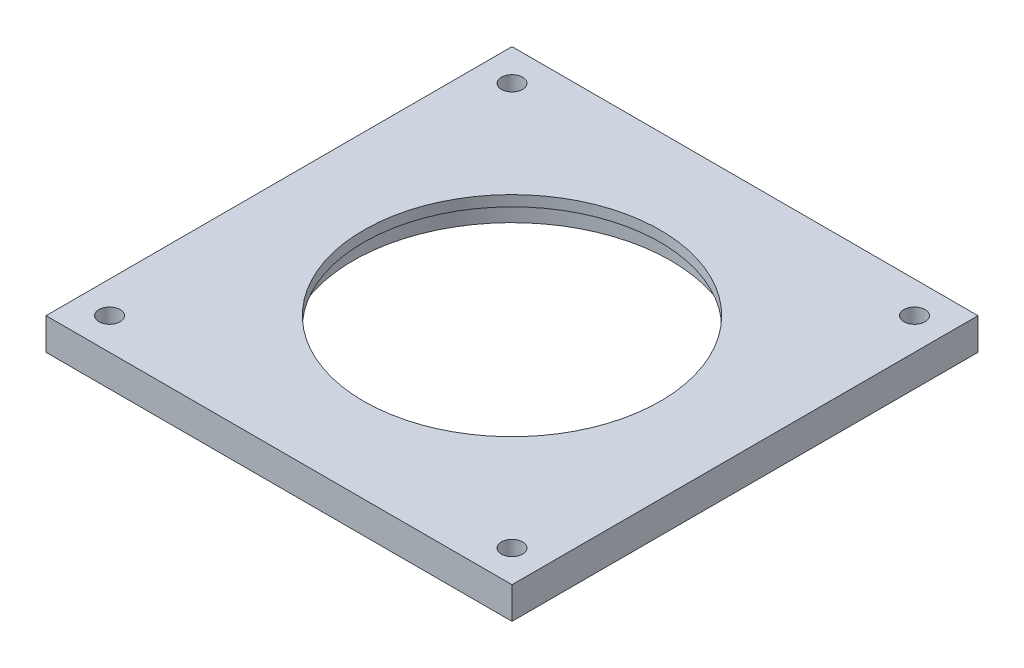
ISO-10303-21;
HEADER;
FILE_DESCRIPTION(('STEP AP214'),'2;1');
FILE_NAME('part.step','',(''),(''),'','','');
FILE_SCHEMA(('AUTOMOTIVE_DESIGN { 1 0 10303 214 1 1 1 1 }'));
ENDSEC;
DATA;
#1=APPLICATION_CONTEXT('core data for automotive mechanical design processes');
#2=APPLICATION_PROTOCOL_DEFINITION('international standard','automotive_design',2000,#1);
#3=PRODUCT_CONTEXT('',#1,'mechanical');
#4=PRODUCT('Part','Part','',(#3));
#5=PRODUCT_RELATED_PRODUCT_CATEGORY('part','',(#4));
#6=PRODUCT_DEFINITION_FORMATION('','',#4);
#7=PRODUCT_DEFINITION_CONTEXT('part definition',#1,'design');
#8=PRODUCT_DEFINITION('design','',#6,#7);
#9=PRODUCT_DEFINITION_SHAPE('','',#8);
#10=(LENGTH_UNIT() NAMED_UNIT(*) SI_UNIT(.MILLI.,.METRE.));
#11=(NAMED_UNIT(*) PLANE_ANGLE_UNIT() SI_UNIT($,.RADIAN.));
#12=(NAMED_UNIT(*) SI_UNIT($,.STERADIAN.) SOLID_ANGLE_UNIT());
#13=UNCERTAINTY_MEASURE_WITH_UNIT(LENGTH_MEASURE(1.E-05),#10,'distance_accuracy_value','');
#14=(GEOMETRIC_REPRESENTATION_CONTEXT(3) GLOBAL_UNCERTAINTY_ASSIGNED_CONTEXT((#13)) GLOBAL_UNIT_ASSIGNED_CONTEXT((#10,
#11,#12)) REPRESENTATION_CONTEXT('',''));
#15=CARTESIAN_POINT('',(0.,0.,0.));
#16=DIRECTION('',(0.,0.,1.));
#17=DIRECTION('',(1.,0.,0.));
#18=AXIS2_PLACEMENT_3D('',#15,#16,#17);
#19=CARTESIAN_POINT('',(22.,3.,-22.));
#20=DIRECTION('',(0.,1.,0.));
#21=DIRECTION('',(0.,0.,1.));
#22=AXIS2_PLACEMENT_3D('',#19,#20,#21);
#23=PLANE('',#22);
#24=DIRECTION('',(0.,0.,1.));
#25=VECTOR('',#24,1.);
#26=CARTESIAN_POINT('',(44.,3.,0.));
#27=LINE('',#26,#25);
#28=CARTESIAN_POINT('',(44.,3.,-44.));
#29=VERTEX_POINT('',#28);
#30=CARTESIAN_POINT('',(44.,3.,0.));
#31=VERTEX_POINT('',#30);
#32=EDGE_CURVE('E83',#29,#31,#27,.T.);
#33=ORIENTED_EDGE('',*,*,#32,.F.);
#34=DIRECTION('',(1.,0.,0.));
#35=VECTOR('',#34,1.);
#36=CARTESIAN_POINT('',(0.,3.,-44.));
#37=LINE('',#36,#35);
#38=CARTESIAN_POINT('',(0.,3.,-44.));
#39=VERTEX_POINT('',#38);
#40=EDGE_CURVE('E86',#39,#29,#37,.T.);
#41=ORIENTED_EDGE('',*,*,#40,.F.);
#42=DIRECTION('',(0.,0.,1.));
#43=VECTOR('',#42,1.);
#44=CARTESIAN_POINT('',(0.,3.,0.));
#45=LINE('',#44,#43);
#46=CARTESIAN_POINT('',(0.,3.,0.));
#47=VERTEX_POINT('',#46);
#48=EDGE_CURVE('E162',#39,#47,#45,.T.);
#49=ORIENTED_EDGE('',*,*,#48,.T.);
#50=DIRECTION('',(1.,0.,0.));
#51=VECTOR('',#50,1.);
#52=CARTESIAN_POINT('',(0.,3.,0.));
#53=LINE('',#52,#51);
#54=EDGE_CURVE('E60',#47,#31,#53,.T.);
#55=ORIENTED_EDGE('',*,*,#54,.T.);
#56=EDGE_LOOP('',(#33,#41,#49,#55));
#57=FACE_BOUND('',#56,.T.);
#58=CARTESIAN_POINT('',(22.,3.,-22.));
#59=DIRECTION('',(0.,-1.,0.));
#60=DIRECTION('',(0.,0.,1.));
#61=AXIS2_PLACEMENT_3D('',#58,#59,#60);
#62=CIRCLE('',#61,14.);
#63=CARTESIAN_POINT('',(22.,3.,-8.));
#64=VERTEX_POINT('',#63);
#65=EDGE_CURVE('E55',#64,#64,#62,.T.);
#66=ORIENTED_EDGE('',*,*,#65,.T.);
#67=EDGE_LOOP('',(#66));
#68=FACE_BOUND('',#67,.T.);
#69=CARTESIAN_POINT('',(3.,3.,-3.));
#70=DIRECTION('',(0.,1.,0.));
#71=DIRECTION('',(0.,0.,1.));
#72=AXIS2_PLACEMENT_3D('',#69,#70,#71);
#73=CIRCLE('',#72,1.);
#74=CARTESIAN_POINT('',(3.,3.,-2.));
#75=VERTEX_POINT('',#74);
#76=EDGE_CURVE('E154',#75,#75,#73,.T.);
#77=ORIENTED_EDGE('',*,*,#76,.F.);
#78=EDGE_LOOP('',(#77));
#79=FACE_BOUND('',#78,.T.);
#80=CARTESIAN_POINT('',(41.,3.,-3.));
#81=DIRECTION('',(0.,-1.,0.));
#82=DIRECTION('',(0.,0.,1.));
#83=AXIS2_PLACEMENT_3D('',#80,#81,#82);
#84=CIRCLE('',#83,1.);
#85=CARTESIAN_POINT('',(41.,3.,-2.));
#86=VERTEX_POINT('',#85);
#87=EDGE_CURVE('E130',#86,#86,#84,.T.);
#88=ORIENTED_EDGE('',*,*,#87,.T.);
#89=EDGE_LOOP('',(#88));
#90=FACE_BOUND('',#89,.T.);
#91=CARTESIAN_POINT('',(3.,3.,-41.));
#92=DIRECTION('',(0.,-1.,0.));
#93=DIRECTION('',(0.,0.,-1.));
#94=AXIS2_PLACEMENT_3D('',#91,#92,#93);
#95=CIRCLE('',#94,1.);
#96=CARTESIAN_POINT('',(3.,3.,-42.));
#97=VERTEX_POINT('',#96);
#98=EDGE_CURVE('E115',#97,#97,#95,.T.);
#99=ORIENTED_EDGE('',*,*,#98,.T.);
#100=EDGE_LOOP('',(#99));
#101=FACE_BOUND('',#100,.T.);
#102=CARTESIAN_POINT('',(41.,3.,-41.));
#103=DIRECTION('',(0.,1.,0.));
#104=DIRECTION('',(0.,0.,-1.));
#105=AXIS2_PLACEMENT_3D('',#102,#103,#104);
#106=CIRCLE('',#105,1.);
#107=CARTESIAN_POINT('',(41.,3.,-42.));
#108=VERTEX_POINT('',#107);
#109=EDGE_CURVE('E110',#108,#108,#106,.T.);
#110=ORIENTED_EDGE('',*,*,#109,.F.);
#111=EDGE_LOOP('',(#110));
#112=FACE_BOUND('',#111,.T.);
#113=ADVANCED_FACE('F45',(#57,#68,#79,#90,#101,#112),#23,.T.);
#114=CARTESIAN_POINT('',(22.,0.,-22.));
#115=DIRECTION('',(0.,1.,0.));
#116=DIRECTION('',(0.,0.,1.));
#117=AXIS2_PLACEMENT_3D('',#114,#115,#116);
#118=PLANE('',#117);
#119=DIRECTION('',(1.,0.,0.));
#120=VECTOR('',#119,1.);
#121=CARTESIAN_POINT('',(0.,0.,-44.));
#122=LINE('',#121,#120);
#123=CARTESIAN_POINT('',(0.,0.,-44.));
#124=VERTEX_POINT('',#123);
#125=CARTESIAN_POINT('',(44.,0.,-44.));
#126=VERTEX_POINT('',#125);
#127=EDGE_CURVE('E103',#124,#126,#122,.T.);
#128=ORIENTED_EDGE('',*,*,#127,.T.);
#129=DIRECTION('',(0.,0.,1.));
#130=VECTOR('',#129,1.);
#131=CARTESIAN_POINT('',(44.,0.,0.));
#132=LINE('',#131,#130);
#133=CARTESIAN_POINT('',(44.,0.,0.));
#134=VERTEX_POINT('',#133);
#135=EDGE_CURVE('E92',#126,#134,#132,.T.);
#136=ORIENTED_EDGE('',*,*,#135,.T.);
#137=DIRECTION('',(1.,0.,0.));
#138=VECTOR('',#137,1.);
#139=CARTESIAN_POINT('',(0.,0.,0.));
#140=LINE('',#139,#138);
#141=CARTESIAN_POINT('',(0.,0.,0.));
#142=VERTEX_POINT('',#141);
#143=EDGE_CURVE('E165',#142,#134,#140,.T.);
#144=ORIENTED_EDGE('',*,*,#143,.F.);
#145=DIRECTION('',(0.,0.,1.));
#146=VECTOR('',#145,1.);
#147=CARTESIAN_POINT('',(0.,0.,0.));
#148=LINE('',#147,#146);
#149=EDGE_CURVE('E158',#124,#142,#148,.T.);
#150=ORIENTED_EDGE('',*,*,#149,.F.);
#151=EDGE_LOOP('',(#128,#136,#144,#150));
#152=FACE_BOUND('',#151,.T.);
#153=CARTESIAN_POINT('',(22.,0.,-22.));
#154=DIRECTION('',(0.,1.,0.));
#155=DIRECTION('',(0.,0.,1.));
#156=AXIS2_PLACEMENT_3D('',#153,#154,#155);
#157=CIRCLE('',#156,15.);
#158=CARTESIAN_POINT('',(22.,0.,-7.));
#159=VERTEX_POINT('',#158);
#160=EDGE_CURVE('E141',#159,#159,#157,.T.);
#161=ORIENTED_EDGE('',*,*,#160,.T.);
#162=EDGE_LOOP('',(#161));
#163=FACE_BOUND('',#162,.T.);
#164=CARTESIAN_POINT('',(3.,0.,-3.));
#165=DIRECTION('',(0.,1.,0.));
#166=DIRECTION('',(0.,0.,1.));
#167=AXIS2_PLACEMENT_3D('',#164,#165,#166);
#168=CIRCLE('',#167,1.);
#169=CARTESIAN_POINT('',(3.,0.,-2.));
#170=VERTEX_POINT('',#169);
#171=EDGE_CURVE('E153',#170,#170,#168,.T.);
#172=ORIENTED_EDGE('',*,*,#171,.T.);
#173=EDGE_LOOP('',(#172));
#174=FACE_BOUND('',#173,.T.);
#175=CARTESIAN_POINT('',(41.,0.,-3.));
#176=DIRECTION('',(0.,-1.,0.));
#177=DIRECTION('',(0.,0.,1.));
#178=AXIS2_PLACEMENT_3D('',#175,#176,#177);
#179=CIRCLE('',#178,1.);
#180=CARTESIAN_POINT('',(41.,0.,-2.));
#181=VERTEX_POINT('',#180);
#182=EDGE_CURVE('E129',#181,#181,#179,.T.);
#183=ORIENTED_EDGE('',*,*,#182,.F.);
#184=EDGE_LOOP('',(#183));
#185=FACE_BOUND('',#184,.T.);
#186=CARTESIAN_POINT('',(3.,0.,-41.));
#187=DIRECTION('',(0.,-1.,0.));
#188=DIRECTION('',(0.,0.,-1.));
#189=AXIS2_PLACEMENT_3D('',#186,#187,#188);
#190=CIRCLE('',#189,1.);
#191=CARTESIAN_POINT('',(3.,0.,-42.));
#192=VERTEX_POINT('',#191);
#193=EDGE_CURVE('E109',#192,#192,#190,.T.);
#194=ORIENTED_EDGE('',*,*,#193,.F.);
#195=EDGE_LOOP('',(#194));
#196=FACE_BOUND('',#195,.T.);
#197=CARTESIAN_POINT('',(41.,0.,-41.));
#198=DIRECTION('',(0.,1.,0.));
#199=DIRECTION('',(0.,0.,-1.));
#200=AXIS2_PLACEMENT_3D('',#197,#198,#199);
#201=CIRCLE('',#200,1.);
#202=CARTESIAN_POINT('',(41.,0.,-42.));
#203=VERTEX_POINT('',#202);
#204=EDGE_CURVE('E118',#203,#203,#201,.T.);
#205=ORIENTED_EDGE('',*,*,#204,.T.);
#206=EDGE_LOOP('',(#205));
#207=FACE_BOUND('',#206,.T.);
#208=ADVANCED_FACE('F177',(#152,#163,#174,#185,#196,#207),#118,.F.);
#209=CARTESIAN_POINT('',(0.,3.,0.));
#210=DIRECTION('',(1.,0.,0.));
#211=DIRECTION('',(0.,0.,-1.));
#212=AXIS2_PLACEMENT_3D('',#209,#210,#211);
#213=PLANE('',#212);
#214=ORIENTED_EDGE('',*,*,#149,.T.);
#215=DIRECTION('',(0.,-1.,0.));
#216=VECTOR('',#215,1.);
#217=CARTESIAN_POINT('',(0.,3.,0.));
#218=LINE('',#217,#216);
#219=EDGE_CURVE('E11',#47,#142,#218,.T.);
#220=ORIENTED_EDGE('',*,*,#219,.F.);
#221=ORIENTED_EDGE('',*,*,#48,.F.);
#222=DIRECTION('',(0.,-1.,0.));
#223=VECTOR('',#222,1.);
#224=CARTESIAN_POINT('',(0.,3.,-44.));
#225=LINE('',#224,#223);
#226=EDGE_CURVE('E101',#39,#124,#225,.T.);
#227=ORIENTED_EDGE('',*,*,#226,.T.);
#228=EDGE_LOOP('',(#214,#220,#221,#227));
#229=FACE_BOUND('',#228,.T.);
#230=ADVANCED_FACE('F47',(#229),#213,.F.);
#231=CARTESIAN_POINT('',(0.,3.,0.));
#232=DIRECTION('',(0.,0.,-1.));
#233=DIRECTION('',(-1.,0.,0.));
#234=AXIS2_PLACEMENT_3D('',#231,#232,#233);
#235=PLANE('',#234);
#236=ORIENTED_EDGE('',*,*,#143,.T.);
#237=DIRECTION('',(0.,-1.,0.));
#238=VECTOR('',#237,1.);
#239=CARTESIAN_POINT('',(44.,3.,0.));
#240=LINE('',#239,#238);
#241=EDGE_CURVE('E91',#31,#134,#240,.T.);
#242=ORIENTED_EDGE('',*,*,#241,.F.);
#243=ORIENTED_EDGE('',*,*,#54,.F.);
#244=ORIENTED_EDGE('',*,*,#219,.T.);
#245=EDGE_LOOP('',(#236,#242,#243,#244));
#246=FACE_BOUND('',#245,.T.);
#247=ADVANCED_FACE('F174',(#246),#235,.F.);
#248=CARTESIAN_POINT('',(22.,3.,-22.));
#249=DIRECTION('',(0.,-1.,0.));
#250=DIRECTION('',(0.,0.,-1.));
#251=AXIS2_PLACEMENT_3D('',#248,#249,#250);
#252=CYLINDRICAL_SURFACE('',#251,14.);
#253=CARTESIAN_POINT('',(22.,2.00000000000001,-22.));
#254=DIRECTION('',(0.,1.,0.));
#255=DIRECTION('',(0.,0.,1.));
#256=AXIS2_PLACEMENT_3D('',#253,#254,#255);
#257=CIRCLE('',#256,14.);
#258=CARTESIAN_POINT('',(22.,2.,-8.));
#259=VERTEX_POINT('',#258);
#260=EDGE_CURVE('E149',#259,#259,#257,.T.);
#261=ORIENTED_EDGE('',*,*,#260,.F.);
#262=EDGE_LOOP('',(#261));
#263=FACE_BOUND('',#262,.T.);
#264=ORIENTED_EDGE('',*,*,#65,.F.);
#265=EDGE_LOOP('',(#264));
#266=FACE_BOUND('',#265,.T.);
#267=ADVANCED_FACE('F185',(#263,#266),#252,.F.);
#268=CARTESIAN_POINT('',(3.,3.,-3.));
#269=DIRECTION('',(0.,-1.,0.));
#270=DIRECTION('',(0.,0.,-1.));
#271=AXIS2_PLACEMENT_3D('',#268,#269,#270);
#272=CYLINDRICAL_SURFACE('',#271,1.);
#273=ORIENTED_EDGE('',*,*,#76,.T.);
#274=EDGE_LOOP('',(#273));
#275=FACE_BOUND('',#274,.T.);
#276=ORIENTED_EDGE('',*,*,#171,.F.);
#277=EDGE_LOOP('',(#276));
#278=FACE_BOUND('',#277,.T.);
#279=ADVANCED_FACE('F193',(#275,#278),#272,.F.);
#280=CARTESIAN_POINT('',(22.,2.,-8.));
#281=DIRECTION('',(0.,1.,0.));
#282=DIRECTION('',(0.,0.,1.));
#283=AXIS2_PLACEMENT_3D('',#280,#281,#282);
#284=PLANE('',#283);
#285=ORIENTED_EDGE('',*,*,#260,.T.);
#286=EDGE_LOOP('',(#285));
#287=FACE_BOUND('',#286,.T.);
#288=CARTESIAN_POINT('',(22.,2.00000000000001,-22.));
#289=DIRECTION('',(0.,1.,0.));
#290=DIRECTION('',(0.,0.,1.));
#291=AXIS2_PLACEMENT_3D('',#288,#289,#290);
#292=CIRCLE('',#291,15.);
#293=CARTESIAN_POINT('',(22.,2.,-7.));
#294=VERTEX_POINT('',#293);
#295=EDGE_CURVE('E145',#294,#294,#292,.T.);
#296=ORIENTED_EDGE('',*,*,#295,.F.);
#297=EDGE_LOOP('',(#296));
#298=FACE_BOUND('',#297,.T.);
#299=ADVANCED_FACE('F201',(#287,#298),#284,.F.);
#300=CARTESIAN_POINT('',(22.,7.36812707009816,-22.));
#301=DIRECTION('',(0.,1.,0.));
#302=DIRECTION('',(0.,0.,1.));
#303=AXIS2_PLACEMENT_3D('',#300,#301,#302);
#304=CYLINDRICAL_SURFACE('',#303,15.);
#305=ORIENTED_EDGE('',*,*,#295,.T.);
#306=EDGE_LOOP('',(#305));
#307=FACE_BOUND('',#306,.T.);
#308=ORIENTED_EDGE('',*,*,#160,.F.);
#309=EDGE_LOOP('',(#308));
#310=FACE_BOUND('',#309,.T.);
#311=ADVANCED_FACE('F238',(#307,#310),#304,.F.);
#312=CARTESIAN_POINT('',(44.,3.,0.));
#313=DIRECTION('',(1.,0.,0.));
#314=DIRECTION('',(0.,0.,-1.));
#315=AXIS2_PLACEMENT_3D('',#312,#313,#314);
#316=PLANE('',#315);
#317=ORIENTED_EDGE('',*,*,#135,.F.);
#318=DIRECTION('',(0.,-1.,0.));
#319=VECTOR('',#318,1.);
#320=CARTESIAN_POINT('',(44.,3.,-44.));
#321=LINE('',#320,#319);
#322=EDGE_CURVE('E99',#29,#126,#321,.T.);
#323=ORIENTED_EDGE('',*,*,#322,.F.);
#324=ORIENTED_EDGE('',*,*,#32,.T.);
#325=ORIENTED_EDGE('',*,*,#241,.T.);
#326=EDGE_LOOP('',(#317,#323,#324,#325));
#327=FACE_BOUND('',#326,.T.);
#328=ADVANCED_FACE('F105',(#327),#316,.T.);
#329=CARTESIAN_POINT('',(41.,3.,-3.));
#330=DIRECTION('',(0.,-1.,0.));
#331=DIRECTION('',(0.,0.,-1.));
#332=AXIS2_PLACEMENT_3D('',#329,#330,#331);
#333=CYLINDRICAL_SURFACE('',#332,1.);
#334=ORIENTED_EDGE('',*,*,#87,.F.);
#335=EDGE_LOOP('',(#334));
#336=FACE_BOUND('',#335,.T.);
#337=ORIENTED_EDGE('',*,*,#182,.T.);
#338=EDGE_LOOP('',(#337));
#339=FACE_BOUND('',#338,.T.);
#340=ADVANCED_FACE('F232',(#336,#339),#333,.F.);
#341=CARTESIAN_POINT('',(0.,3.,-44.));
#342=DIRECTION('',(0.,0.,-1.));
#343=DIRECTION('',(-1.,0.,0.));
#344=AXIS2_PLACEMENT_3D('',#341,#342,#343);
#345=PLANE('',#344);
#346=ORIENTED_EDGE('',*,*,#127,.F.);
#347=ORIENTED_EDGE('',*,*,#226,.F.);
#348=ORIENTED_EDGE('',*,*,#40,.T.);
#349=ORIENTED_EDGE('',*,*,#322,.T.);
#350=EDGE_LOOP('',(#346,#347,#348,#349));
#351=FACE_BOUND('',#350,.T.);
#352=ADVANCED_FACE('F98',(#351),#345,.T.);
#353=CARTESIAN_POINT('',(3.,3.,-41.));
#354=DIRECTION('',(0.,-1.,0.));
#355=DIRECTION('',(0.,0.,-1.));
#356=AXIS2_PLACEMENT_3D('',#353,#354,#355);
#357=CYLINDRICAL_SURFACE('',#356,1.);
#358=ORIENTED_EDGE('',*,*,#98,.F.);
#359=EDGE_LOOP('',(#358));
#360=FACE_BOUND('',#359,.T.);
#361=ORIENTED_EDGE('',*,*,#193,.T.);
#362=EDGE_LOOP('',(#361));
#363=FACE_BOUND('',#362,.T.);
#364=ADVANCED_FACE('F218',(#360,#363),#357,.F.);
#365=CARTESIAN_POINT('',(41.,3.,-41.));
#366=DIRECTION('',(0.,-1.,0.));
#367=DIRECTION('',(0.,0.,-1.));
#368=AXIS2_PLACEMENT_3D('',#365,#366,#367);
#369=CYLINDRICAL_SURFACE('',#368,1.);
#370=ORIENTED_EDGE('',*,*,#109,.T.);
#371=EDGE_LOOP('',(#370));
#372=FACE_BOUND('',#371,.T.);
#373=ORIENTED_EDGE('',*,*,#204,.F.);
#374=EDGE_LOOP('',(#373));
#375=FACE_BOUND('',#374,.T.);
#376=ADVANCED_FACE('F215',(#372,#375),#369,.F.);
#377=CLOSED_SHELL('',(#113,#208,#230,#247,#267,#279,#299,#311,#328,#340,#352,#364,#376));
#378=MANIFOLD_SOLID_BREP('B2',#377);
#379=ADVANCED_BREP_SHAPE_REPRESENTATION('',(#18,#378),#14);
#380=SHAPE_DEFINITION_REPRESENTATION(#9,#379);
ENDSEC;
END-ISO-10303-21;
